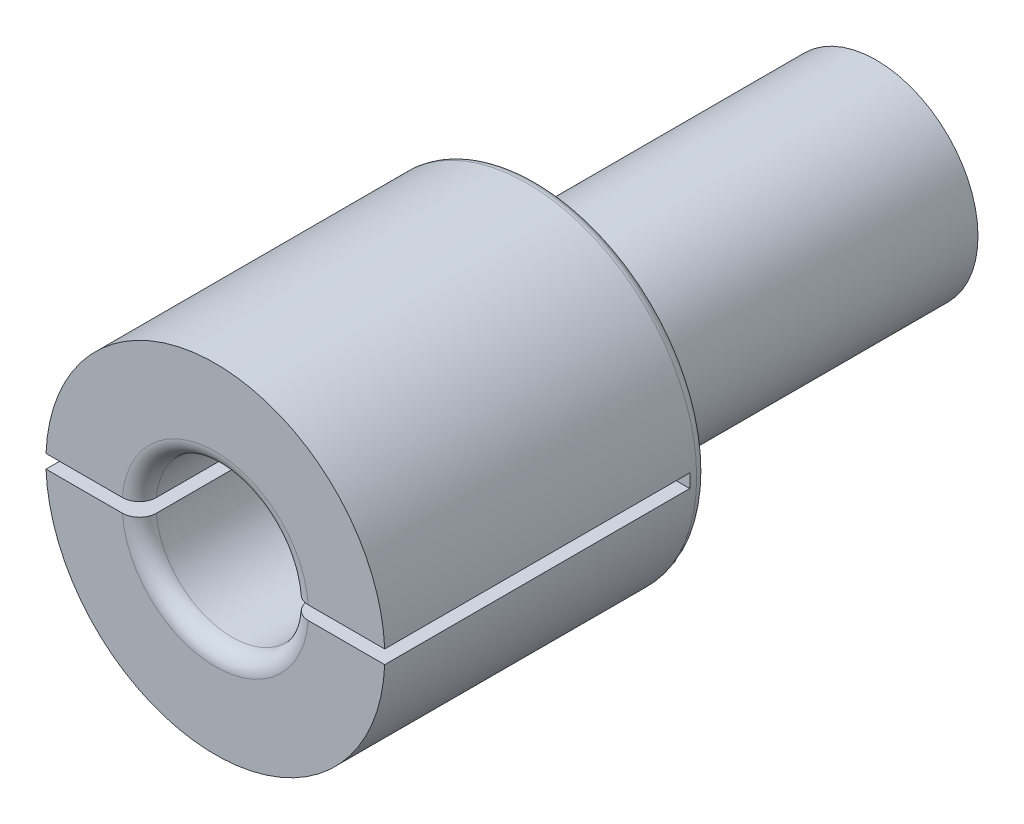
ISO-10303-21;
HEADER;
FILE_DESCRIPTION(('STEP AP214'),'2;1');
FILE_NAME('part.step','',(''),(''),'','','');
FILE_SCHEMA(('AUTOMOTIVE_DESIGN { 1 0 10303 214 1 1 1 1 }'));
ENDSEC;
DATA;
#1=APPLICATION_CONTEXT('core data for automotive mechanical design processes');
#2=APPLICATION_PROTOCOL_DEFINITION('international standard','automotive_design',2000,#1);
#3=PRODUCT_CONTEXT('',#1,'mechanical');
#4=PRODUCT('Part','Part','',(#3));
#5=PRODUCT_RELATED_PRODUCT_CATEGORY('part','',(#4));
#6=PRODUCT_DEFINITION_FORMATION('','',#4);
#7=PRODUCT_DEFINITION_CONTEXT('part definition',#1,'design');
#8=PRODUCT_DEFINITION('design','',#6,#7);
#9=PRODUCT_DEFINITION_SHAPE('','',#8);
#10=(LENGTH_UNIT() NAMED_UNIT(*) SI_UNIT(.MILLI.,.METRE.));
#11=(NAMED_UNIT(*) PLANE_ANGLE_UNIT() SI_UNIT($,.RADIAN.));
#12=(NAMED_UNIT(*) SI_UNIT($,.STERADIAN.) SOLID_ANGLE_UNIT());
#13=UNCERTAINTY_MEASURE_WITH_UNIT(LENGTH_MEASURE(1.E-05),#10,'distance_accuracy_value','');
#14=(GEOMETRIC_REPRESENTATION_CONTEXT(3) GLOBAL_UNCERTAINTY_ASSIGNED_CONTEXT((#13)) GLOBAL_UNIT_ASSIGNED_CONTEXT((#10,
#11,#12)) REPRESENTATION_CONTEXT('',''));
#15=CARTESIAN_POINT('',(0.,0.,0.));
#16=DIRECTION('',(0.,0.,1.));
#17=DIRECTION('',(1.,0.,0.));
#18=AXIS2_PLACEMENT_3D('',#15,#16,#17);
#19=CARTESIAN_POINT('',(-26.1833274784012,4.38375634517767,-1.5));
#20=DIRECTION('',(0.,0.,1.));
#21=DIRECTION('',(1.,0.,0.));
#22=AXIS2_PLACEMENT_3D('',#19,#20,#21);
#23=CYLINDRICAL_SURFACE('',#22,2.25);
#24=DIRECTION('',(0.,0.,1.));
#25=VECTOR('',#24,1.);
#26=CARTESIAN_POINT('',(-28.4244209615027,4.58375634517767,-1.5));
#27=LINE('',#26,#25);
#28=CARTESIAN_POINT('',(-28.4244209615027,4.58375634517767,9.));
#29=VERTEX_POINT('',#28);
#30=CARTESIAN_POINT('',(-28.4244209615027,4.58375634517767,1.00000000000001));
#31=VERTEX_POINT('',#30);
#32=EDGE_CURVE('E168',#29,#31,#27,.F.);
#33=ORIENTED_EDGE('',*,*,#32,.T.);
#34=CARTESIAN_POINT('',(-26.1833274784012,4.38375634517767,1.00000000000001));
#35=DIRECTION('',(0.,0.,-1.));
#36=DIRECTION('',(-1.,0.,0.));
#37=AXIS2_PLACEMENT_3D('',#34,#35,#36);
#38=CIRCLE('',#37,2.25);
#39=CARTESIAN_POINT('',(-23.9422339952997,4.58375634517767,1.00000000000001));
#40=VERTEX_POINT('',#39);
#41=EDGE_CURVE('E228',#31,#40,#38,.T.);
#42=ORIENTED_EDGE('',*,*,#41,.T.);
#43=DIRECTION('',(0.,0.,1.));
#44=VECTOR('',#43,1.);
#45=CARTESIAN_POINT('',(-23.9422339952997,4.58375634517767,-1.5));
#46=LINE('',#45,#44);
#47=CARTESIAN_POINT('',(-23.9422339952997,4.58375634517767,9.));
#48=VERTEX_POINT('',#47);
#49=EDGE_CURVE('E164',#40,#48,#46,.T.);
#50=ORIENTED_EDGE('',*,*,#49,.T.);
#51=CARTESIAN_POINT('',(-26.1833274784012,4.38375634517767,9.));
#52=DIRECTION('',(0.,0.,1.));
#53=DIRECTION('',(1.,0.,0.));
#54=AXIS2_PLACEMENT_3D('',#51,#52,#53);
#55=CIRCLE('',#54,2.25);
#56=EDGE_CURVE('E171',#48,#29,#55,.T.);
#57=ORIENTED_EDGE('',*,*,#56,.T.);
#58=EDGE_LOOP('',(#33,#42,#50,#57));
#59=FACE_BOUND('',#58,.T.);
#60=ADVANCED_FACE('F31',(#59),#23,.F.);
#61=CARTESIAN_POINT('',(-26.1833274784012,4.38375634517767,9.5));
#62=DIRECTION('',(0.,0.,1.));
#63=DIRECTION('',(1.,0.,0.));
#64=AXIS2_PLACEMENT_3D('',#61,#62,#63);
#65=PLANE('',#64);
#66=DIRECTION('',(-1.,0.,0.));
#67=VECTOR('',#66,1.);
#68=CARTESIAN_POINT('',(-31.1833274784012,4.58375634517767,9.5));
#69=LINE('',#68,#67);
#70=CARTESIAN_POINT('',(-28.9260451087817,4.58375634517767,9.5));
#71=VERTEX_POINT('',#70);
#72=CARTESIAN_POINT('',(-31.1793258771199,4.58375634517767,9.5));
#73=VERTEX_POINT('',#72);
#74=EDGE_CURVE('E143',#71,#73,#69,.T.);
#75=ORIENTED_EDGE('',*,*,#74,.F.);
#76=CARTESIAN_POINT('',(-26.1833274784012,4.38375634517767,9.5));
#77=DIRECTION('',(0.,0.,1.));
#78=DIRECTION('',(1.,0.,0.));
#79=AXIS2_PLACEMENT_3D('',#76,#77,#78);
#80=CIRCLE('',#79,2.75);
#81=CARTESIAN_POINT('',(-23.4406098480207,4.58375634517767,9.5));
#82=VERTEX_POINT('',#81);
#83=EDGE_CURVE('E240',#71,#82,#80,.F.);
#84=ORIENTED_EDGE('',*,*,#83,.T.);
#85=CARTESIAN_POINT('',(-21.1873290796824,4.58375634517767,9.5));
#86=VERTEX_POINT('',#85);
#87=EDGE_CURVE('E293',#86,#82,#69,.T.);
#88=ORIENTED_EDGE('',*,*,#87,.F.);
#89=CARTESIAN_POINT('',(-26.1833274784012,4.38375634517767,9.5));
#90=DIRECTION('',(0.,0.,1.));
#91=DIRECTION('',(1.,0.,0.));
#92=AXIS2_PLACEMENT_3D('',#89,#90,#91);
#93=CIRCLE('',#92,5.);
#94=EDGE_CURVE('E149',#86,#73,#93,.T.);
#95=ORIENTED_EDGE('',*,*,#94,.T.);
#96=EDGE_LOOP('',(#75,#84,#88,#95));
#97=FACE_BOUND('',#96,.T.);
#98=ADVANCED_FACE('F304',(#97),#65,.T.);
#99=CARTESIAN_POINT('',(-26.1833274784012,4.38375634517767,0.));
#100=DIRECTION('',(0.,0.,1.));
#101=DIRECTION('',(1.,0.,0.));
#102=AXIS2_PLACEMENT_3D('',#99,#100,#101);
#103=PLANE('',#102);
#104=CARTESIAN_POINT('',(-26.1833274784012,4.38375634517767,0.));
#105=DIRECTION('',(0.,0.,1.));
#106=DIRECTION('',(1.,0.,0.));
#107=AXIS2_PLACEMENT_3D('',#104,#105,#106);
#108=CIRCLE('',#107,4.7);
#109=CARTESIAN_POINT('',(-21.4833274784012,4.38375634517767,0.));
#110=VERTEX_POINT('',#109);
#111=EDGE_CURVE('E258',#110,#110,#108,.F.);
#112=ORIENTED_EDGE('',*,*,#111,.T.);
#113=EDGE_LOOP('',(#112));
#114=FACE_BOUND('',#113,.T.);
#115=CARTESIAN_POINT('',(-26.1833274784012,4.38375634517767,0.));
#116=DIRECTION('',(0.,0.,1.));
#117=DIRECTION('',(1.,0.,0.));
#118=AXIS2_PLACEMENT_3D('',#115,#116,#117);
#119=CIRCLE('',#118,3.);
#120=CARTESIAN_POINT('',(-23.1833274784012,4.38375634517767,0.));
#121=VERTEX_POINT('',#120);
#122=EDGE_CURVE('E153',#121,#121,#119,.F.);
#123=ORIENTED_EDGE('',*,*,#122,.F.);
#124=EDGE_LOOP('',(#123));
#125=FACE_BOUND('',#124,.T.);
#126=ADVANCED_FACE('F306',(#114,#125),#103,.F.);
#127=CARTESIAN_POINT('',(-26.1833274784012,4.38375634517767,9.5));
#128=DIRECTION('',(0.,0.,-1.));
#129=DIRECTION('',(-1.,0.,0.));
#130=AXIS2_PLACEMENT_3D('',#127,#128,#129);
#131=CYLINDRICAL_SURFACE('',#130,5.);
#132=CARTESIAN_POINT('',(-26.1833274784012,4.38375634517767,0.3));
#133=DIRECTION('',(0.,0.,1.));
#134=DIRECTION('',(1.,0.,0.));
#135=AXIS2_PLACEMENT_3D('',#132,#133,#134);
#136=CIRCLE('',#135,5.);
#137=CARTESIAN_POINT('',(-21.1833274784012,4.38375634517767,0.3));
#138=VERTEX_POINT('',#137);
#139=EDGE_CURVE('E255',#138,#138,#136,.T.);
#140=ORIENTED_EDGE('',*,*,#139,.T.);
#141=EDGE_LOOP('',(#140));
#142=FACE_BOUND('',#141,.T.);
#143=CARTESIAN_POINT('',(-26.1833274784012,4.38375634517767,0.5));
#144=DIRECTION('',(0.,0.,1.));
#145=DIRECTION('',(1.,0.,0.));
#146=AXIS2_PLACEMENT_3D('',#143,#144,#145);
#147=CIRCLE('',#146,5.);
#148=CARTESIAN_POINT('',(-31.1793258771199,4.58375634517767,0.5));
#149=VERTEX_POINT('',#148);
#150=CARTESIAN_POINT('',(-31.1793258771199,4.18375634517767,0.5));
#151=VERTEX_POINT('',#150);
#152=EDGE_CURVE('E296',#149,#151,#147,.T.);
#153=ORIENTED_EDGE('',*,*,#152,.F.);
#154=DIRECTION('',(0.,0.,-1.));
#155=VECTOR('',#154,1.);
#156=CARTESIAN_POINT('',(-31.1793258771199,4.58375634517767,9.5));
#157=LINE('',#156,#155);
#158=EDGE_CURVE('E133',#149,#73,#157,.F.);
#159=ORIENTED_EDGE('',*,*,#158,.T.);
#160=ORIENTED_EDGE('',*,*,#94,.F.);
#161=DIRECTION('',(0.,0.,-1.));
#162=VECTOR('',#161,1.);
#163=CARTESIAN_POINT('',(-21.1873290796824,4.58375634517767,9.5));
#164=LINE('',#163,#162);
#165=CARTESIAN_POINT('',(-21.1873290796824,4.58375634517767,0.5));
#166=VERTEX_POINT('',#165);
#167=EDGE_CURVE('E155',#86,#166,#164,.T.);
#168=ORIENTED_EDGE('',*,*,#167,.T.);
#169=CARTESIAN_POINT('',(-21.1873290796824,4.18375634517767,0.5));
#170=VERTEX_POINT('',#169);
#171=EDGE_CURVE('E294',#170,#166,#147,.T.);
#172=ORIENTED_EDGE('',*,*,#171,.F.);
#173=DIRECTION('',(0.,0.,-1.));
#174=VECTOR('',#173,1.);
#175=CARTESIAN_POINT('',(-21.1873290796824,4.18375634517767,9.5));
#176=LINE('',#175,#174);
#177=CARTESIAN_POINT('',(-21.1873290796824,4.18375634517767,9.5));
#178=VERTEX_POINT('',#177);
#179=EDGE_CURVE('E134',#170,#178,#176,.F.);
#180=ORIENTED_EDGE('',*,*,#179,.T.);
#181=CARTESIAN_POINT('',(-31.1793258771199,4.18375634517767,9.5));
#182=VERTEX_POINT('',#181);
#183=EDGE_CURVE('E140',#182,#178,#93,.T.);
#184=ORIENTED_EDGE('',*,*,#183,.F.);
#185=DIRECTION('',(0.,0.,-1.));
#186=VECTOR('',#185,1.);
#187=CARTESIAN_POINT('',(-31.1793258771199,4.18375634517767,9.5));
#188=LINE('',#187,#186);
#189=EDGE_CURVE('E124',#182,#151,#188,.T.);
#190=ORIENTED_EDGE('',*,*,#189,.T.);
#191=EDGE_LOOP('',(#153,#159,#160,#168,#172,#180,#184,#190));
#192=FACE_BOUND('',#191,.T.);
#193=ADVANCED_FACE('F147',(#142,#192),#131,.T.);
#194=DIRECTION('',(1.,0.,0.));
#195=VECTOR('',#194,1.);
#196=CARTESIAN_POINT('',(-31.1833274784012,4.18375634517767,9.5));
#197=LINE('',#196,#195);
#198=CARTESIAN_POINT('',(-23.4406098480207,4.18375634517767,9.5));
#199=VERTEX_POINT('',#198);
#200=EDGE_CURVE('E144',#199,#178,#197,.T.);
#201=ORIENTED_EDGE('',*,*,#200,.F.);
#202=CARTESIAN_POINT('',(-26.1833274784012,4.38375634517767,9.5));
#203=DIRECTION('',(0.,0.,1.));
#204=DIRECTION('',(1.,0.,0.));
#205=AXIS2_PLACEMENT_3D('',#202,#203,#204);
#206=CIRCLE('',#205,2.75);
#207=CARTESIAN_POINT('',(-28.9260451087817,4.18375634517767,9.5));
#208=VERTEX_POINT('',#207);
#209=EDGE_CURVE('E142',#199,#208,#206,.F.);
#210=ORIENTED_EDGE('',*,*,#209,.T.);
#211=EDGE_CURVE('E128',#182,#208,#197,.T.);
#212=ORIENTED_EDGE('',*,*,#211,.F.);
#213=ORIENTED_EDGE('',*,*,#183,.T.);
#214=EDGE_LOOP('',(#201,#210,#212,#213));
#215=FACE_BOUND('',#214,.T.);
#216=ADVANCED_FACE('F139',(#215),#65,.T.);
#217=DIRECTION('',(0.,0.,1.));
#218=VECTOR('',#217,1.);
#219=CARTESIAN_POINT('',(-23.9422339952997,4.18375634517767,-1.5));
#220=LINE('',#219,#218);
#221=CARTESIAN_POINT('',(-23.9422339952997,4.18375634517767,9.));
#222=VERTEX_POINT('',#221);
#223=CARTESIAN_POINT('',(-23.9422339952997,4.18375634517767,1.00000000000001));
#224=VERTEX_POINT('',#223);
#225=EDGE_CURVE('E161',#222,#224,#220,.F.);
#226=ORIENTED_EDGE('',*,*,#225,.T.);
#227=CARTESIAN_POINT('',(-26.1833274784012,4.38375634517767,1.00000000000001));
#228=DIRECTION('',(0.,0.,-1.));
#229=DIRECTION('',(-1.,0.,0.));
#230=AXIS2_PLACEMENT_3D('',#227,#228,#229);
#231=CIRCLE('',#230,2.25);
#232=CARTESIAN_POINT('',(-28.4244209615027,4.18375634517767,1.00000000000001));
#233=VERTEX_POINT('',#232);
#234=EDGE_CURVE('E264',#224,#233,#231,.T.);
#235=ORIENTED_EDGE('',*,*,#234,.T.);
#236=DIRECTION('',(0.,0.,1.));
#237=VECTOR('',#236,1.);
#238=CARTESIAN_POINT('',(-28.4244209615027,4.18375634517767,-1.5));
#239=LINE('',#238,#237);
#240=CARTESIAN_POINT('',(-28.4244209615027,4.18375634517767,9.));
#241=VERTEX_POINT('',#240);
#242=EDGE_CURVE('E166',#233,#241,#239,.T.);
#243=ORIENTED_EDGE('',*,*,#242,.T.);
#244=CARTESIAN_POINT('',(-26.1833274784012,4.38375634517767,9.));
#245=DIRECTION('',(0.,0.,1.));
#246=DIRECTION('',(1.,0.,0.));
#247=AXIS2_PLACEMENT_3D('',#244,#245,#246);
#248=CIRCLE('',#247,2.25);
#249=EDGE_CURVE('E174',#241,#222,#248,.T.);
#250=ORIENTED_EDGE('',*,*,#249,.T.);
#251=EDGE_LOOP('',(#226,#235,#243,#250));
#252=FACE_BOUND('',#251,.T.);
#253=ADVANCED_FACE('F285',(#252),#23,.F.);
#254=CARTESIAN_POINT('',(-26.1833274784012,4.38375634517767,0.));
#255=DIRECTION('',(0.,0.,-1.));
#256=DIRECTION('',(-1.,0.,0.));
#257=AXIS2_PLACEMENT_3D('',#254,#255,#256);
#258=PLANE('',#257);
#259=CARTESIAN_POINT('',(-26.1833274784012,4.38375634517767,0.));
#260=DIRECTION('',(0.,0.,-1.));
#261=DIRECTION('',(-1.,0.,0.));
#262=AXIS2_PLACEMENT_3D('',#259,#260,#261);
#263=CIRCLE('',#262,1.24999999999998);
#264=CARTESIAN_POINT('',(-27.4333274784011,4.38375634517767,0.));
#265=VERTEX_POINT('',#264);
#266=EDGE_CURVE('E261',#265,#265,#263,.F.);
#267=ORIENTED_EDGE('',*,*,#266,.T.);
#268=EDGE_LOOP('',(#267));
#269=FACE_BOUND('',#268,.T.);
#270=ADVANCED_FACE('F321',(#269),#258,.F.);
#271=CARTESIAN_POINT('',(-26.1833274784012,4.38375634517767,-10.));
#272=DIRECTION('',(0.,0.,1.));
#273=DIRECTION('',(1.,0.,0.));
#274=AXIS2_PLACEMENT_3D('',#271,#272,#273);
#275=CYLINDRICAL_SURFACE('',#274,3.);
#276=CARTESIAN_POINT('',(-26.1833274784012,4.38375634517767,-10.));
#277=DIRECTION('',(0.,0.,-1.));
#278=DIRECTION('',(-1.,0.,0.));
#279=AXIS2_PLACEMENT_3D('',#276,#277,#278);
#280=CIRCLE('',#279,3.);
#281=CARTESIAN_POINT('',(-29.1833274784012,4.38375634517767,-10.));
#282=VERTEX_POINT('',#281);
#283=EDGE_CURVE('E150',#282,#282,#280,.T.);
#284=ORIENTED_EDGE('',*,*,#283,.F.);
#285=EDGE_LOOP('',(#284));
#286=FACE_BOUND('',#285,.T.);
#287=ORIENTED_EDGE('',*,*,#122,.T.);
#288=EDGE_LOOP('',(#287));
#289=FACE_BOUND('',#288,.T.);
#290=ADVANCED_FACE('F337',(#286,#289),#275,.T.);
#291=CARTESIAN_POINT('',(-26.1833274784012,4.38375634517767,-10.));
#292=DIRECTION('',(0.,0.,-1.));
#293=DIRECTION('',(-1.,0.,0.));
#294=AXIS2_PLACEMENT_3D('',#291,#292,#293);
#295=PLANE('',#294);
#296=ORIENTED_EDGE('',*,*,#283,.T.);
#297=EDGE_LOOP('',(#296));
#298=FACE_BOUND('',#297,.T.);
#299=ADVANCED_FACE('F198',(#298),#295,.T.);
#300=CARTESIAN_POINT('',(-31.1833274784012,4.38375634517767,0.5));
#301=DIRECTION('',(0.,0.,1.));
#302=DIRECTION('',(1.,0.,0.));
#303=AXIS2_PLACEMENT_3D('',#300,#301,#302);
#304=PLANE('',#303);
#305=ORIENTED_EDGE('',*,*,#171,.T.);
#306=DIRECTION('',(-1.,0.,0.));
#307=VECTOR('',#306,1.);
#308=CARTESIAN_POINT('',(-31.1833274784012,4.58375634517767,0.5));
#309=LINE('',#308,#307);
#310=CARTESIAN_POINT('',(-24.4447936133298,4.58375634517767,0.5));
#311=VERTEX_POINT('',#310);
#312=EDGE_CURVE('E280',#166,#311,#309,.T.);
#313=ORIENTED_EDGE('',*,*,#312,.T.);
#314=CARTESIAN_POINT('',(-26.1833274784012,4.38375634517767,0.5));
#315=DIRECTION('',(0.,0.,1.));
#316=DIRECTION('',(1.,0.,0.));
#317=AXIS2_PLACEMENT_3D('',#314,#315,#316);
#318=CIRCLE('',#317,1.74999999999999);
#319=CARTESIAN_POINT('',(-24.4447936133298,4.18375634517767,0.5));
#320=VERTEX_POINT('',#319);
#321=EDGE_CURVE('E216',#311,#320,#318,.F.);
#322=ORIENTED_EDGE('',*,*,#321,.T.);
#323=DIRECTION('',(1.,0.,0.));
#324=VECTOR('',#323,1.);
#325=CARTESIAN_POINT('',(-31.1833274784012,4.18375634517767,0.5));
#326=LINE('',#325,#324);
#327=EDGE_CURVE('E279',#320,#170,#326,.T.);
#328=ORIENTED_EDGE('',*,*,#327,.T.);
#329=EDGE_LOOP('',(#305,#313,#322,#328));
#330=FACE_BOUND('',#329,.T.);
#331=ADVANCED_FACE('F278',(#330),#304,.T.);
#332=CARTESIAN_POINT('',(-31.1833274784012,4.18375634517767,0.5));
#333=DIRECTION('',(0.,-1.,0.));
#334=DIRECTION('',(1.,0.,0.));
#335=AXIS2_PLACEMENT_3D('',#332,#333,#334);
#336=PLANE('',#335);
#337=ORIENTED_EDGE('',*,*,#225,.F.);
#338=CARTESIAN_POINT('',(-23.9422339952997,4.18375634517767,9.));
#339=CARTESIAN_POINT('',(-23.9422584428226,4.18375634517767,9.02805365823792));
#340=CARTESIAN_POINT('',(-23.9398650669706,4.18375634517767,9.0560993826151));
#341=CARTESIAN_POINT('',(-23.930424069559,4.18375634517767,9.11137110288992));
#342=CARTESIAN_POINT('',(-23.9233806889157,4.18375634517767,9.13859782210497));
#343=CARTESIAN_POINT('',(-23.9048164509858,4.18375634517767,9.1914930828795));
#344=CARTESIAN_POINT('',(-23.8932936516399,4.18375634517767,9.21716094300457));
#345=CARTESIAN_POINT('',(-23.8661139371574,4.18375634517767,9.26619976850742));
#346=CARTESIAN_POINT('',(-23.8504575926033,4.18375634517767,9.2895710502876));
#347=CARTESIAN_POINT('',(-23.8154230257549,4.18375634517767,9.33340880173297));
#348=CARTESIAN_POINT('',(-23.7960376111717,4.18375634517767,9.35386952292409));
#349=CARTESIAN_POINT('',(-23.7541134309621,4.18375634517767,9.39126421814221));
#350=CARTESIAN_POINT('',(-23.7315740197026,4.18375634517767,9.40819746831402));
#351=CARTESIAN_POINT('',(-23.6838968590264,4.18375634517767,9.43811647465693));
#352=CARTESIAN_POINT('',(-23.6587497226587,4.18375634517767,9.45108725643597));
#353=CARTESIAN_POINT('',(-23.6066431295319,4.18375634517767,9.47262810664229));
#354=CARTESIAN_POINT('',(-23.57968468215,4.18375634517767,9.48120060344293));
#355=CARTESIAN_POINT('',(-23.533909762425,4.18375634517767,9.49162378294088));
#356=CARTESIAN_POINT('',(-23.5153762833676,4.18375634517767,9.49476273446214));
#357=CARTESIAN_POINT('',(-23.4781010461401,4.18375634517767,9.49895063573003));
#358=CARTESIAN_POINT('',(-23.4593596160856,4.18375634517767,9.50000250692002));
#359=CARTESIAN_POINT('',(-23.4406098480207,4.18375634517767,9.5));
#360=B_SPLINE_CURVE_WITH_KNOTS('',3,(#338,#339,#340,#341,#342,#343,#344,#345,#346,#347,#348,
#349,#350,#351,#352,#353,#354,#355,#356,#357,#358,#359),.UNSPECIFIED.,.F.,.F.,(4,2,2,2,2,2,2,2,
2,2,4),(0.,0.0840475464943348,0.168018545299724,0.252025990544332,0.336021845705833,
0.420181358801179,0.50435812488594,0.588849172990335,0.673293521710332,0.729575999512428,
0.785779638760283),.UNSPECIFIED.);
#361=EDGE_CURVE('E177',#222,#199,#360,.T.);
#362=ORIENTED_EDGE('',*,*,#361,.T.);
#363=ORIENTED_EDGE('',*,*,#200,.T.);
#364=ORIENTED_EDGE('',*,*,#179,.F.);
#365=ORIENTED_EDGE('',*,*,#327,.F.);
#366=CARTESIAN_POINT('',(-24.4447936133298,4.18375634517767,0.5));
#367=CARTESIAN_POINT('',(-24.3609802147313,4.18375634517767,0.583279599542059));
#368=CARTESIAN_POINT('',(-24.2771935467246,4.18375634517767,0.666586066516038));
#369=CARTESIAN_POINT('',(-24.1096736740493,4.18375634517767,0.833252733184089));
#370=CARTESIAN_POINT('',(-24.0259404693793,4.18375634517767,0.91661293287678));
#371=CARTESIAN_POINT('',(-23.9422339952997,4.18375634517767,1.00000000000001));
#372=B_SPLINE_CURVE_WITH_KNOTS('',3,(#366,#367,#368,#369,#370,#371),.UNSPECIFIED.,.F.,.F.,(4,2,
4),(0.,0.354459530240369,0.708919051362287),.UNSPECIFIED.);
#373=EDGE_CURVE('E210',#320,#224,#372,.T.);
#374=ORIENTED_EDGE('',*,*,#373,.T.);
#375=EDGE_LOOP('',(#337,#362,#363,#364,#365,#374));
#376=FACE_BOUND('',#375,.T.);
#377=ADVANCED_FACE('F194',(#376),#336,.F.);
#378=CARTESIAN_POINT('',(-31.1833274784012,4.58375634517767,0.5));
#379=DIRECTION('',(0.,1.,0.));
#380=DIRECTION('',(-1.,0.,0.));
#381=AXIS2_PLACEMENT_3D('',#378,#379,#380);
#382=PLANE('',#381);
#383=ORIENTED_EDGE('',*,*,#87,.T.);
#384=CARTESIAN_POINT('',(-23.4406098480207,4.58375634517767,9.5));
#385=CARTESIAN_POINT('',(-23.4688883149799,4.58375634517767,9.50002358141519));
#386=CARTESIAN_POINT('',(-23.4971596429571,4.58375634517767,9.49761507564123));
#387=CARTESIAN_POINT('',(-23.5528828082673,4.58375634517767,9.48811023974408));
#388=CARTESIAN_POINT('',(-23.5803352284384,4.58375634517767,9.48101733106068));
#389=CARTESIAN_POINT('',(-23.6336718176992,4.58375634517767,9.4623150435565));
#390=CARTESIAN_POINT('',(-23.6595552215599,4.58375634517767,9.45070348109104));
#391=CARTESIAN_POINT('',(-23.7089992265589,4.58375634517767,9.42330038982002));
#392=CARTESIAN_POINT('',(-23.7325602575439,4.58375634517767,9.40750963653977));
#393=CARTESIAN_POINT('',(-23.7766744990959,4.58375634517767,9.37220263835706));
#394=CARTESIAN_POINT('',(-23.7972299035663,4.58375634517767,9.35268913503154));
#395=CARTESIAN_POINT('',(-23.8347658780096,4.58375634517767,9.31047478445031));
#396=CARTESIAN_POINT('',(-23.8517457767686,4.58375634517767,9.28777334006747));
#397=CARTESIAN_POINT('',(-23.8815925316932,4.58375634517767,9.23989714152258));
#398=CARTESIAN_POINT('',(-23.8944701440796,4.58375634517767,9.21472908551598));
#399=CARTESIAN_POINT('',(-23.9157928848849,4.58375634517767,9.16258827541344));
#400=CARTESIAN_POINT('',(-23.9242408507603,4.58375634517767,9.13561668910459));
#401=CARTESIAN_POINT('',(-23.9343008513218,4.58375634517767,9.09039200930899));
#402=CARTESIAN_POINT('',(-23.9372739361646,4.58375634517767,9.07243006901909));
#403=CARTESIAN_POINT('',(-23.941240223291,4.58375634517767,9.03631467651642));
#404=CARTESIAN_POINT('',(-23.9422362181761,4.58375634517767,9.01816153089063));
#405=CARTESIAN_POINT('',(-23.9422339952997,4.58375634517767,9.));
#406=B_SPLINE_CURVE_WITH_KNOTS('',3,(#384,#385,#386,#387,#388,#389,#390,#391,#392,#393,#394,
#395,#396,#397,#398,#399,#400,#401,#402,#403,#404,#405),.UNSPECIFIED.,.F.,.F.,(4,2,2,2,2,2,2,2,
2,2,4),(0.,0.0847228639140904,0.169383915452655,0.25408593045014,0.338772238446567,
0.423396419252598,0.508036472046686,0.592452735739122,0.676814859447091,0.731332896920137,
0.78577387376911),.UNSPECIFIED.);
#407=EDGE_CURVE('E238',#82,#48,#406,.T.);
#408=ORIENTED_EDGE('',*,*,#407,.T.);
#409=ORIENTED_EDGE('',*,*,#49,.F.);
#410=CARTESIAN_POINT('',(-23.9422339952997,4.58375634517767,1.00000000000001));
#411=CARTESIAN_POINT('',(-24.0259404693793,4.58375634517767,0.91661293287678));
#412=CARTESIAN_POINT('',(-24.1096736740493,4.58375634517767,0.833252733184089));
#413=CARTESIAN_POINT('',(-24.2771935467246,4.58375634517767,0.666586066516039));
#414=CARTESIAN_POINT('',(-24.3609802147313,4.58375634517767,0.583279599542061));
#415=CARTESIAN_POINT('',(-24.4447936133298,4.58375634517767,0.500000000000002));
#416=B_SPLINE_CURVE_WITH_KNOTS('',3,(#410,#411,#412,#413,#414,#415),.UNSPECIFIED.,.F.,.F.,(4,2,
4),(0.,0.354459521121918,0.708919051362286),.UNSPECIFIED.);
#417=EDGE_CURVE('E266',#40,#311,#416,.T.);
#418=ORIENTED_EDGE('',*,*,#417,.T.);
#419=ORIENTED_EDGE('',*,*,#312,.F.);
#420=ORIENTED_EDGE('',*,*,#167,.F.);
#421=EDGE_LOOP('',(#383,#408,#409,#418,#419,#420));
#422=FACE_BOUND('',#421,.T.);
#423=ADVANCED_FACE('F195',(#422),#382,.F.);
#424=ORIENTED_EDGE('',*,*,#32,.F.);
#425=CARTESIAN_POINT('',(-28.4244209615027,4.58375634517767,9.));
#426=CARTESIAN_POINT('',(-28.4243965139797,4.58375634517767,9.02805365823792));
#427=CARTESIAN_POINT('',(-28.4267898898317,4.58375634517767,9.05609938261511));
#428=CARTESIAN_POINT('',(-28.4362308872433,4.58375634517767,9.11137110288992));
#429=CARTESIAN_POINT('',(-28.4432742678866,4.58375634517767,9.13859782210497));
#430=CARTESIAN_POINT('',(-28.4618385058165,4.58375634517767,9.1914930828795));
#431=CARTESIAN_POINT('',(-28.4733613051625,4.58375634517767,9.21716094300457));
#432=CARTESIAN_POINT('',(-28.5005410196449,4.58375634517767,9.26619976850742));
#433=CARTESIAN_POINT('',(-28.516197364199,4.58375634517767,9.2895710502876));
#434=CARTESIAN_POINT('',(-28.5512319310474,4.58375634517767,9.33340880173297));
#435=CARTESIAN_POINT('',(-28.5706173456306,4.58375634517767,9.35386952292409));
#436=CARTESIAN_POINT('',(-28.6125415258402,4.58375634517767,9.39126421814221));
#437=CARTESIAN_POINT('',(-28.6350809370997,4.58375634517767,9.40819746831402));
#438=CARTESIAN_POINT('',(-28.6827580977759,4.58375634517767,9.43811647465693));
#439=CARTESIAN_POINT('',(-28.7079052341436,4.58375634517767,9.45108725643597));
#440=CARTESIAN_POINT('',(-28.7600118272704,4.58375634517767,9.47262810664229));
#441=CARTESIAN_POINT('',(-28.7869702746523,4.58375634517767,9.48120060344293));
#442=CARTESIAN_POINT('',(-28.8327451943773,4.58375634517767,9.49162378294088));
#443=CARTESIAN_POINT('',(-28.8512786734347,4.58375634517767,9.49476273446214));
#444=CARTESIAN_POINT('',(-28.8885539106622,4.58375634517767,9.49895063573003));
#445=CARTESIAN_POINT('',(-28.9072953407167,4.58375634517767,9.50000250692002));
#446=CARTESIAN_POINT('',(-28.9260451087816,4.58375634517767,9.5));
#447=B_SPLINE_CURVE_WITH_KNOTS('',3,(#425,#426,#427,#428,#429,#430,#431,#432,#433,#434,#435,
#436,#437,#438,#439,#440,#441,#442,#443,#444,#445,#446),.UNSPECIFIED.,.F.,.F.,(4,2,2,2,2,2,2,2,
2,2,4),(0.,0.0840475464943345,0.168018545299725,0.252025990544333,0.336021845705833,
0.420181358801179,0.50435812488594,0.588849172990335,0.673293521710333,0.729575999512428,
0.785779638760284),.UNSPECIFIED.);
#448=EDGE_CURVE('E239',#29,#71,#447,.T.);
#449=ORIENTED_EDGE('',*,*,#448,.T.);
#450=ORIENTED_EDGE('',*,*,#74,.T.);
#451=ORIENTED_EDGE('',*,*,#158,.F.);
#452=CARTESIAN_POINT('',(-27.9218613434725,4.58375634517767,0.5));
#453=VERTEX_POINT('',#452);
#454=EDGE_CURVE('E50',#453,#149,#309,.T.);
#455=ORIENTED_EDGE('',*,*,#454,.F.);
#456=CARTESIAN_POINT('',(-27.9218613434725,4.58375634517767,0.5));
#457=CARTESIAN_POINT('',(-28.005674742071,4.58375634517767,0.583279599542059));
#458=CARTESIAN_POINT('',(-28.0894614100777,4.58375634517767,0.666586066516038));
#459=CARTESIAN_POINT('',(-28.256981282753,4.58375634517767,0.833252733184089));
#460=CARTESIAN_POINT('',(-28.340714487423,4.58375634517767,0.91661293287678));
#461=CARTESIAN_POINT('',(-28.4244209615027,4.58375634517767,1.00000000000001));
#462=B_SPLINE_CURVE_WITH_KNOTS('',3,(#456,#457,#458,#459,#460,#461),.UNSPECIFIED.,.F.,.F.,(4,2,
4),(0.,0.354459530240369,0.708919051362287),.UNSPECIFIED.);
#463=EDGE_CURVE('E11',#453,#31,#462,.T.);
#464=ORIENTED_EDGE('',*,*,#463,.T.);
#465=EDGE_LOOP('',(#424,#449,#450,#451,#455,#464));
#466=FACE_BOUND('',#465,.T.);
#467=ADVANCED_FACE('F193',(#466),#382,.F.);
#468=ORIENTED_EDGE('',*,*,#211,.T.);
#469=CARTESIAN_POINT('',(-28.9260451087817,4.18375634517767,9.5));
#470=CARTESIAN_POINT('',(-28.8977666418224,4.18375634517767,9.50002358141519));
#471=CARTESIAN_POINT('',(-28.8694953138452,4.18375634517767,9.49761507564123));
#472=CARTESIAN_POINT('',(-28.813772148535,4.18375634517767,9.48811023974408));
#473=CARTESIAN_POINT('',(-28.7863197283639,4.18375634517767,9.48101733106068));
#474=CARTESIAN_POINT('',(-28.7329831391031,4.18375634517767,9.4623150435565));
#475=CARTESIAN_POINT('',(-28.7070997352424,4.18375634517767,9.45070348109103));
#476=CARTESIAN_POINT('',(-28.6576557302434,4.18375634517767,9.42330038982002));
#477=CARTESIAN_POINT('',(-28.6340946992584,4.18375634517767,9.40750963653977));
#478=CARTESIAN_POINT('',(-28.5899804577064,4.18375634517767,9.37220263835706));
#479=CARTESIAN_POINT('',(-28.569425053236,4.18375634517767,9.35268913503154));
#480=CARTESIAN_POINT('',(-28.5318890787927,4.18375634517767,9.31047478445031));
#481=CARTESIAN_POINT('',(-28.5149091800337,4.18375634517767,9.28777334006746));
#482=CARTESIAN_POINT('',(-28.4850624251091,4.18375634517767,9.23989714152258));
#483=CARTESIAN_POINT('',(-28.4721848127227,4.18375634517767,9.21472908551598));
#484=CARTESIAN_POINT('',(-28.4508620719174,4.18375634517767,9.16258827541344));
#485=CARTESIAN_POINT('',(-28.442414106042,4.18375634517767,9.13561668910459));
#486=CARTESIAN_POINT('',(-28.4323541054805,4.18375634517767,9.09039200930899));
#487=CARTESIAN_POINT('',(-28.4293810206378,4.18375634517767,9.07243006901909));
#488=CARTESIAN_POINT('',(-28.4254147335113,4.18375634517767,9.03631467651642));
#489=CARTESIAN_POINT('',(-28.4244187386262,4.18375634517767,9.01816153089063));
#490=CARTESIAN_POINT('',(-28.4244209615027,4.18375634517767,9.));
#491=B_SPLINE_CURVE_WITH_KNOTS('',3,(#469,#470,#471,#472,#473,#474,#475,#476,#477,#478,#479,
#480,#481,#482,#483,#484,#485,#486,#487,#488,#489,#490),.UNSPECIFIED.,.F.,.F.,(4,2,2,2,2,2,2,2,
2,2,4),(0.,0.0847228639140904,0.169383915452655,0.254085930450141,0.338772238446568,
0.423396419252602,0.508036472046686,0.592452735739122,0.67681485944709,0.731332896920137,
0.785773873769109),.UNSPECIFIED.);
#492=EDGE_CURVE('E204',#208,#241,#491,.T.);
#493=ORIENTED_EDGE('',*,*,#492,.T.);
#494=ORIENTED_EDGE('',*,*,#242,.F.);
#495=CARTESIAN_POINT('',(-28.4244209615027,4.18375634517767,1.00000000000001));
#496=CARTESIAN_POINT('',(-28.340714487423,4.18375634517767,0.91661293287678));
#497=CARTESIAN_POINT('',(-28.256981282753,4.18375634517767,0.833252733184089));
#498=CARTESIAN_POINT('',(-28.0894614100777,4.18375634517767,0.666586066516039));
#499=CARTESIAN_POINT('',(-28.005674742071,4.18375634517767,0.58327959954206));
#500=CARTESIAN_POINT('',(-27.9218613434725,4.18375634517767,0.500000000000002));
#501=B_SPLINE_CURVE_WITH_KNOTS('',3,(#495,#496,#497,#498,#499,#500),.UNSPECIFIED.,.F.,.F.,(4,2,
4),(0.,0.354459521121918,0.708919051362286),.UNSPECIFIED.);
#502=CARTESIAN_POINT('',(-27.9218613434725,4.18375634517767,0.5));
#503=VERTEX_POINT('',#502);
#504=EDGE_CURVE('E215',#233,#503,#501,.T.);
#505=ORIENTED_EDGE('',*,*,#504,.T.);
#506=EDGE_CURVE('E57',#151,#503,#326,.T.);
#507=ORIENTED_EDGE('',*,*,#506,.F.);
#508=ORIENTED_EDGE('',*,*,#189,.F.);
#509=EDGE_LOOP('',(#468,#493,#494,#505,#507,#508));
#510=FACE_BOUND('',#509,.T.);
#511=ADVANCED_FACE('F126',(#510),#336,.F.);
#512=ORIENTED_EDGE('',*,*,#152,.T.);
#513=ORIENTED_EDGE('',*,*,#506,.T.);
#514=CARTESIAN_POINT('',(-26.1833274784012,4.38375634517767,0.5));
#515=DIRECTION('',(0.,0.,1.));
#516=DIRECTION('',(1.,0.,0.));
#517=AXIS2_PLACEMENT_3D('',#514,#515,#516);
#518=CIRCLE('',#517,1.74999999999999);
#519=EDGE_CURVE('E44',#503,#453,#518,.F.);
#520=ORIENTED_EDGE('',*,*,#519,.T.);
#521=ORIENTED_EDGE('',*,*,#454,.T.);
#522=EDGE_LOOP('',(#512,#513,#520,#521));
#523=FACE_BOUND('',#522,.T.);
#524=ADVANCED_FACE('F192',(#523),#304,.T.);
#525=CARTESIAN_POINT('',(-26.1833274784012,4.38375634517767,9.));
#526=DIRECTION('',(0.,0.,1.));
#527=DIRECTION('',(1.,0.,0.));
#528=AXIS2_PLACEMENT_3D('',#525,#526,#527);
#529=TOROIDAL_SURFACE('',#528,2.75,0.5);
#530=ORIENTED_EDGE('',*,*,#492,.F.);
#531=ORIENTED_EDGE('',*,*,#209,.F.);
#532=ORIENTED_EDGE('',*,*,#361,.F.);
#533=ORIENTED_EDGE('',*,*,#249,.F.);
#534=EDGE_LOOP('',(#530,#531,#532,#533));
#535=FACE_BOUND('',#534,.T.);
#536=ADVANCED_FACE('F185',(#535),#529,.T.);
#537=CARTESIAN_POINT('',(-26.1833274784012,4.38375634517767,9.));
#538=DIRECTION('',(0.,0.,1.));
#539=DIRECTION('',(1.,0.,0.));
#540=AXIS2_PLACEMENT_3D('',#537,#538,#539);
#541=TOROIDAL_SURFACE('',#540,2.75,0.5);
#542=ORIENTED_EDGE('',*,*,#407,.F.);
#543=ORIENTED_EDGE('',*,*,#83,.F.);
#544=ORIENTED_EDGE('',*,*,#448,.F.);
#545=ORIENTED_EDGE('',*,*,#56,.F.);
#546=EDGE_LOOP('',(#542,#543,#544,#545));
#547=FACE_BOUND('',#546,.T.);
#548=ADVANCED_FACE('F236',(#547),#541,.T.);
#549=CARTESIAN_POINT('',(-26.1833274784012,4.38375634517767,0.3));
#550=DIRECTION('',(0.,0.,1.));
#551=DIRECTION('',(1.,0.,0.));
#552=AXIS2_PLACEMENT_3D('',#549,#550,#551);
#553=TOROIDAL_SURFACE('',#552,4.7,0.3);
#554=ORIENTED_EDGE('',*,*,#111,.F.);
#555=EDGE_LOOP('',(#554));
#556=FACE_BOUND('',#555,.T.);
#557=ORIENTED_EDGE('',*,*,#139,.F.);
#558=EDGE_LOOP('',(#557));
#559=FACE_BOUND('',#558,.T.);
#560=ADVANCED_FACE('F249',(#556,#559),#553,.T.);
#561=CARTESIAN_POINT('',(-26.1833274784012,4.38375634517767,0.));
#562=DIRECTION('',(0.,0.,1.));
#563=DIRECTION('',(1.,0.,0.));
#564=AXIS2_PLACEMENT_3D('',#561,#562,#563);
#565=CONICAL_SURFACE('',#564,1.24999999999998,0.785398163397454);
#566=ORIENTED_EDGE('',*,*,#417,.F.);
#567=ORIENTED_EDGE('',*,*,#41,.F.);
#568=ORIENTED_EDGE('',*,*,#463,.F.);
#569=ORIENTED_EDGE('',*,*,#519,.F.);
#570=ORIENTED_EDGE('',*,*,#504,.F.);
#571=ORIENTED_EDGE('',*,*,#234,.F.);
#572=ORIENTED_EDGE('',*,*,#373,.F.);
#573=ORIENTED_EDGE('',*,*,#321,.F.);
#574=EDGE_LOOP('',(#566,#567,#568,#569,#570,#571,#572,#573));
#575=FACE_BOUND('',#574,.T.);
#576=ORIENTED_EDGE('',*,*,#266,.F.);
#577=EDGE_LOOP('',(#576));
#578=FACE_BOUND('',#577,.T.);
#579=ADVANCED_FACE('F33',(#575,#578),#565,.F.);
#580=CLOSED_SHELL('',(#60,#98,#126,#193,#216,#253,#270,#290,#299,#331,#377,#423,#467,#511,#524,
#536,#548,#560,#579));
#581=MANIFOLD_SOLID_BREP('B2',#580);
#582=ADVANCED_BREP_SHAPE_REPRESENTATION('',(#18,#581),#14);
#583=SHAPE_DEFINITION_REPRESENTATION(#9,#582);
ENDSEC;
END-ISO-10303-21;
